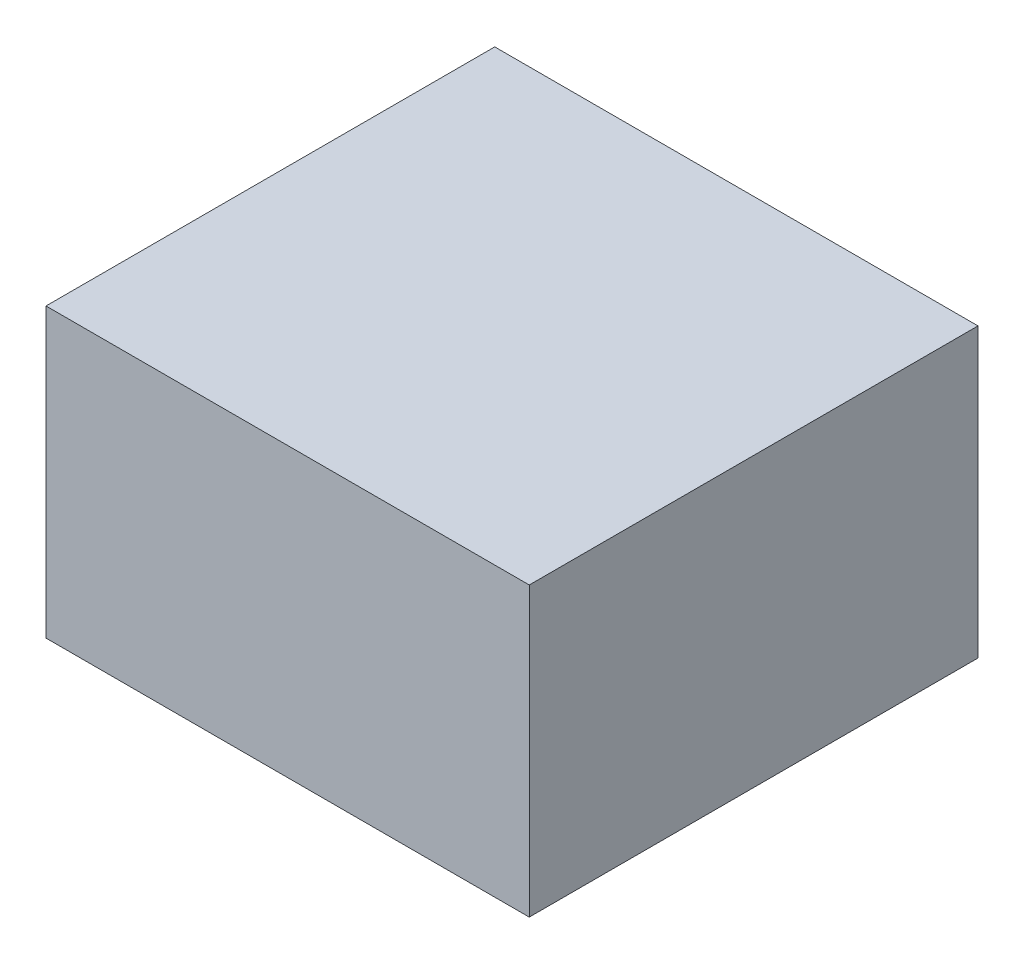
ISO-10303-21;
HEADER;
FILE_DESCRIPTION(('STEP AP214'),'2;1');
FILE_NAME('part.step','',(''),(''),'','','');
FILE_SCHEMA(('AUTOMOTIVE_DESIGN { 1 0 10303 214 1 1 1 1 }'));
ENDSEC;
DATA;
#1=APPLICATION_CONTEXT('core data for automotive mechanical design processes');
#2=APPLICATION_PROTOCOL_DEFINITION('international standard','automotive_design',2000,#1);
#3=PRODUCT_CONTEXT('',#1,'mechanical');
#4=PRODUCT('Part','Part','',(#3));
#5=PRODUCT_RELATED_PRODUCT_CATEGORY('part','',(#4));
#6=PRODUCT_DEFINITION_FORMATION('','',#4);
#7=PRODUCT_DEFINITION_CONTEXT('part definition',#1,'design');
#8=PRODUCT_DEFINITION('design','',#6,#7);
#9=PRODUCT_DEFINITION_SHAPE('','',#8);
#10=(LENGTH_UNIT() NAMED_UNIT(*) SI_UNIT(.MILLI.,.METRE.));
#11=(NAMED_UNIT(*) PLANE_ANGLE_UNIT() SI_UNIT($,.RADIAN.));
#12=(NAMED_UNIT(*) SI_UNIT($,.STERADIAN.) SOLID_ANGLE_UNIT());
#13=UNCERTAINTY_MEASURE_WITH_UNIT(LENGTH_MEASURE(1.E-05),#10,'distance_accuracy_value','');
#14=(GEOMETRIC_REPRESENTATION_CONTEXT(3) GLOBAL_UNCERTAINTY_ASSIGNED_CONTEXT((#13)) GLOBAL_UNIT_ASSIGNED_CONTEXT((#10,
#11,#12)) REPRESENTATION_CONTEXT('',''));
#15=CARTESIAN_POINT('',(0.,0.,0.));
#16=DIRECTION('',(0.,0.,1.));
#17=DIRECTION('',(1.,0.,0.));
#18=AXIS2_PLACEMENT_3D('',#15,#16,#17);
#19=CARTESIAN_POINT('',(-21.,-12.5,39.));
#20=DIRECTION('',(1.,0.,0.));
#21=DIRECTION('',(0.,0.,-1.));
#22=AXIS2_PLACEMENT_3D('',#19,#20,#21);
#23=PLANE('',#22);
#24=DIRECTION('',(0.,0.,1.));
#25=VECTOR('',#24,1.);
#26=CARTESIAN_POINT('',(-21.,1.21222729040687,39.));
#27=LINE('',#26,#25);
#28=CARTESIAN_POINT('',(-21.,1.21222729040687,6.));
#29=VERTEX_POINT('',#28);
#30=CARTESIAN_POINT('',(-21.,1.21222729040687,10.));
#31=VERTEX_POINT('',#30);
#32=EDGE_CURVE('E333',#29,#31,#27,.T.);
#33=ORIENTED_EDGE('',*,*,#32,.T.);
#34=DIRECTION('',(0.,-1.,0.));
#35=VECTOR('',#34,1.);
#36=CARTESIAN_POINT('',(-21.,-12.5,10.));
#37=LINE('',#36,#35);
#38=CARTESIAN_POINT('',(-21.,-1.78777270959313,10.));
#39=VERTEX_POINT('',#38);
#40=EDGE_CURVE('E326',#31,#39,#37,.T.);
#41=ORIENTED_EDGE('',*,*,#40,.T.);
#42=DIRECTION('',(0.,0.,-1.));
#43=VECTOR('',#42,1.);
#44=CARTESIAN_POINT('',(-21.,-1.78777270959313,39.));
#45=LINE('',#44,#43);
#46=CARTESIAN_POINT('',(-21.,-1.78777270959313,6.));
#47=VERTEX_POINT('',#46);
#48=EDGE_CURVE('E331',#39,#47,#45,.T.);
#49=ORIENTED_EDGE('',*,*,#48,.T.);
#50=DIRECTION('',(0.,1.,0.));
#51=VECTOR('',#50,1.);
#52=CARTESIAN_POINT('',(-21.,-12.5,6.));
#53=LINE('',#52,#51);
#54=EDGE_CURVE('E119',#47,#29,#53,.T.);
#55=ORIENTED_EDGE('',*,*,#54,.T.);
#56=EDGE_LOOP('',(#33,#41,#49,#55));
#57=FACE_BOUND('',#56,.T.);
#58=DIRECTION('',(0.,-1.,0.));
#59=VECTOR('',#58,1.);
#60=CARTESIAN_POINT('',(-21.,-12.5,0.));
#61=LINE('',#60,#59);
#62=CARTESIAN_POINT('',(-21.,12.5,0.));
#63=VERTEX_POINT('',#62);
#64=CARTESIAN_POINT('',(-21.,-12.5,0.));
#65=VERTEX_POINT('',#64);
#66=EDGE_CURVE('E132',#63,#65,#61,.T.);
#67=ORIENTED_EDGE('',*,*,#66,.T.);
#68=DIRECTION('',(0.,0.,-1.));
#69=VECTOR('',#68,1.);
#70=CARTESIAN_POINT('',(-21.,-12.5,39.));
#71=LINE('',#70,#69);
#72=CARTESIAN_POINT('',(-21.,-12.5,39.));
#73=VERTEX_POINT('',#72);
#74=EDGE_CURVE('E11',#73,#65,#71,.T.);
#75=ORIENTED_EDGE('',*,*,#74,.F.);
#76=DIRECTION('',(0.,-1.,0.));
#77=VECTOR('',#76,1.);
#78=CARTESIAN_POINT('',(-21.,-12.5,39.));
#79=LINE('',#78,#77);
#80=CARTESIAN_POINT('',(-21.,12.5,39.));
#81=VERTEX_POINT('',#80);
#82=EDGE_CURVE('E146',#81,#73,#79,.T.);
#83=ORIENTED_EDGE('',*,*,#82,.F.);
#84=DIRECTION('',(0.,0.,-1.));
#85=VECTOR('',#84,1.);
#86=CARTESIAN_POINT('',(-21.,12.5,39.));
#87=LINE('',#86,#85);
#88=EDGE_CURVE('E155',#81,#63,#87,.T.);
#89=ORIENTED_EDGE('',*,*,#88,.T.);
#90=EDGE_LOOP('',(#67,#75,#83,#89));
#91=FACE_BOUND('',#90,.T.);
#92=ADVANCED_FACE('F37',(#57,#91),#23,.F.);
#93=CARTESIAN_POINT('',(21.,-12.5,39.));
#94=DIRECTION('',(0.,1.,0.));
#95=DIRECTION('',(-1.,0.,0.));
#96=AXIS2_PLACEMENT_3D('',#93,#94,#95);
#97=PLANE('',#96);
#98=DIRECTION('',(1.,0.,0.));
#99=VECTOR('',#98,1.);
#100=CARTESIAN_POINT('',(21.,-12.5,0.));
#101=LINE('',#100,#99);
#102=CARTESIAN_POINT('',(21.,-12.5,0.));
#103=VERTEX_POINT('',#102);
#104=EDGE_CURVE('E136',#65,#103,#101,.T.);
#105=ORIENTED_EDGE('',*,*,#104,.T.);
#106=DIRECTION('',(0.,0.,-1.));
#107=VECTOR('',#106,1.);
#108=CARTESIAN_POINT('',(21.,-12.5,39.));
#109=LINE('',#108,#107);
#110=CARTESIAN_POINT('',(21.,-12.5,39.));
#111=VERTEX_POINT('',#110);
#112=EDGE_CURVE('E44',#111,#103,#109,.T.);
#113=ORIENTED_EDGE('',*,*,#112,.F.);
#114=DIRECTION('',(1.,0.,0.));
#115=VECTOR('',#114,1.);
#116=CARTESIAN_POINT('',(21.,-12.5,39.));
#117=LINE('',#116,#115);
#118=EDGE_CURVE('E149',#73,#111,#117,.T.);
#119=ORIENTED_EDGE('',*,*,#118,.F.);
#120=ORIENTED_EDGE('',*,*,#74,.T.);
#121=EDGE_LOOP('',(#105,#113,#119,#120));
#122=FACE_BOUND('',#121,.T.);
#123=ADVANCED_FACE('F186',(#122),#97,.F.);
#124=CARTESIAN_POINT('',(21.,-12.5,39.));
#125=DIRECTION('',(-1.,0.,0.));
#126=DIRECTION('',(0.,0.,1.));
#127=AXIS2_PLACEMENT_3D('',#124,#125,#126);
#128=PLANE('',#127);
#129=DIRECTION('',(0.,1.,0.));
#130=VECTOR('',#129,1.);
#131=CARTESIAN_POINT('',(21.,-12.5,0.));
#132=LINE('',#131,#130);
#133=CARTESIAN_POINT('',(21.,12.5,0.));
#134=VERTEX_POINT('',#133);
#135=EDGE_CURVE('E158',#103,#134,#132,.T.);
#136=ORIENTED_EDGE('',*,*,#135,.T.);
#137=DIRECTION('',(0.,0.,-1.));
#138=VECTOR('',#137,1.);
#139=CARTESIAN_POINT('',(21.,12.5,39.));
#140=LINE('',#139,#138);
#141=CARTESIAN_POINT('',(21.,12.5,39.));
#142=VERTEX_POINT('',#141);
#143=EDGE_CURVE('E163',#142,#134,#140,.T.);
#144=ORIENTED_EDGE('',*,*,#143,.F.);
#145=DIRECTION('',(0.,1.,0.));
#146=VECTOR('',#145,1.);
#147=CARTESIAN_POINT('',(21.,-12.5,39.));
#148=LINE('',#147,#146);
#149=EDGE_CURVE('E152',#111,#142,#148,.T.);
#150=ORIENTED_EDGE('',*,*,#149,.F.);
#151=ORIENTED_EDGE('',*,*,#112,.T.);
#152=EDGE_LOOP('',(#136,#144,#150,#151));
#153=FACE_BOUND('',#152,.T.);
#154=ADVANCED_FACE('F170',(#153),#128,.F.);
#155=CARTESIAN_POINT('',(21.,12.5,39.));
#156=DIRECTION('',(0.,-1.,0.));
#157=DIRECTION('',(1.,0.,0.));
#158=AXIS2_PLACEMENT_3D('',#155,#156,#157);
#159=PLANE('',#158);
#160=DIRECTION('',(-1.,0.,0.));
#161=VECTOR('',#160,1.);
#162=CARTESIAN_POINT('',(21.,12.5,0.));
#163=LINE('',#162,#161);
#164=EDGE_CURVE('E150',#134,#63,#163,.T.);
#165=ORIENTED_EDGE('',*,*,#164,.T.);
#166=ORIENTED_EDGE('',*,*,#88,.F.);
#167=DIRECTION('',(-1.,0.,0.));
#168=VECTOR('',#167,1.);
#169=CARTESIAN_POINT('',(21.,12.5,39.));
#170=LINE('',#169,#168);
#171=EDGE_CURVE('E154',#142,#81,#170,.T.);
#172=ORIENTED_EDGE('',*,*,#171,.F.);
#173=ORIENTED_EDGE('',*,*,#143,.T.);
#174=EDGE_LOOP('',(#165,#166,#172,#173));
#175=FACE_BOUND('',#174,.T.);
#176=ADVANCED_FACE('F179',(#175),#159,.F.);
#177=CARTESIAN_POINT('',(0.,0.,39.));
#178=DIRECTION('',(0.,0.,1.));
#179=DIRECTION('',(1.,0.,0.));
#180=AXIS2_PLACEMENT_3D('',#177,#178,#179);
#181=PLANE('',#180);
#182=ORIENTED_EDGE('',*,*,#82,.T.);
#183=ORIENTED_EDGE('',*,*,#118,.T.);
#184=ORIENTED_EDGE('',*,*,#149,.T.);
#185=ORIENTED_EDGE('',*,*,#171,.T.);
#186=EDGE_LOOP('',(#182,#183,#184,#185));
#187=FACE_BOUND('',#186,.T.);
#188=ADVANCED_FACE('F185',(#187),#181,.T.);
#189=CARTESIAN_POINT('',(0.,0.,0.));
#190=DIRECTION('',(0.,0.,1.));
#191=DIRECTION('',(1.,0.,0.));
#192=AXIS2_PLACEMENT_3D('',#189,#190,#191);
#193=PLANE('',#192);
#194=DIRECTION('',(1.,0.,0.));
#195=VECTOR('',#194,1.);
#196=CARTESIAN_POINT('',(-6.,1.21222729040687,0.));
#197=LINE('',#196,#195);
#198=CARTESIAN_POINT('',(-16.,1.21222729040687,0.));
#199=VERTEX_POINT('',#198);
#200=CARTESIAN_POINT('',(-6.,1.21222729040687,0.));
#201=VERTEX_POINT('',#200);
#202=EDGE_CURVE('E336',#199,#201,#197,.T.);
#203=ORIENTED_EDGE('',*,*,#202,.F.);
#204=DIRECTION('',(0.,1.,0.));
#205=VECTOR('',#204,1.);
#206=CARTESIAN_POINT('',(-16.,-1.78777270959313,0.));
#207=LINE('',#206,#205);
#208=CARTESIAN_POINT('',(-16.,-1.78777270959313,0.));
#209=VERTEX_POINT('',#208);
#210=EDGE_CURVE('E334',#209,#199,#207,.T.);
#211=ORIENTED_EDGE('',*,*,#210,.F.);
#212=DIRECTION('',(-1.,0.,0.));
#213=VECTOR('',#212,1.);
#214=CARTESIAN_POINT('',(-6.,-1.78777270959313,0.));
#215=LINE('',#214,#213);
#216=CARTESIAN_POINT('',(-6.,-1.78777270959313,0.));
#217=VERTEX_POINT('',#216);
#218=EDGE_CURVE('E130',#217,#209,#215,.T.);
#219=ORIENTED_EDGE('',*,*,#218,.F.);
#220=DIRECTION('',(0.,-1.,0.));
#221=VECTOR('',#220,1.);
#222=CARTESIAN_POINT('',(-6.,-1.78777270959313,0.));
#223=LINE('',#222,#221);
#224=EDGE_CURVE('E344',#201,#217,#223,.T.);
#225=ORIENTED_EDGE('',*,*,#224,.F.);
#226=EDGE_LOOP('',(#203,#211,#219,#225));
#227=FACE_BOUND('',#226,.T.);
#228=ORIENTED_EDGE('',*,*,#66,.F.);
#229=ORIENTED_EDGE('',*,*,#164,.F.);
#230=ORIENTED_EDGE('',*,*,#135,.F.);
#231=ORIENTED_EDGE('',*,*,#104,.F.);
#232=EDGE_LOOP('',(#228,#229,#230,#231));
#233=FACE_BOUND('',#232,.T.);
#234=ADVANCED_FACE('F176',(#227,#233),#193,.F.);
#235=CARTESIAN_POINT('',(-16.,-1.78777270959313,10.));
#236=DIRECTION('',(-1.,0.,0.));
#237=DIRECTION('',(0.,0.,1.));
#238=AXIS2_PLACEMENT_3D('',#235,#236,#237);
#239=PLANE('',#238);
#240=DIRECTION('',(0.,0.,-1.));
#241=VECTOR('',#240,1.);
#242=CARTESIAN_POINT('',(-16.,1.21222729040687,10.));
#243=LINE('',#242,#241);
#244=CARTESIAN_POINT('',(-16.,1.21222729040687,6.));
#245=VERTEX_POINT('',#244);
#246=EDGE_CURVE('E59',#245,#199,#243,.T.);
#247=ORIENTED_EDGE('',*,*,#246,.F.);
#248=DIRECTION('',(0.,1.,0.));
#249=VECTOR('',#248,1.);
#250=CARTESIAN_POINT('',(-16.,1.21222729040687,6.));
#251=LINE('',#250,#249);
#252=CARTESIAN_POINT('',(-16.,-1.78777270959313,6.));
#253=VERTEX_POINT('',#252);
#254=EDGE_CURVE('E117',#253,#245,#251,.T.);
#255=ORIENTED_EDGE('',*,*,#254,.F.);
#256=DIRECTION('',(0.,0.,-1.));
#257=VECTOR('',#256,1.);
#258=CARTESIAN_POINT('',(-16.,-1.78777270959313,10.));
#259=LINE('',#258,#257);
#260=EDGE_CURVE('E125',#253,#209,#259,.T.);
#261=ORIENTED_EDGE('',*,*,#260,.T.);
#262=ORIENTED_EDGE('',*,*,#210,.T.);
#263=EDGE_LOOP('',(#247,#255,#261,#262));
#264=FACE_BOUND('',#263,.T.);
#265=ADVANCED_FACE('F124',(#264),#239,.F.);
#266=CARTESIAN_POINT('',(-6.,-1.78777270959313,10.));
#267=DIRECTION('',(0.,-1.,0.));
#268=DIRECTION('',(0.,0.,-1.));
#269=AXIS2_PLACEMENT_3D('',#266,#267,#268);
#270=PLANE('',#269);
#271=ORIENTED_EDGE('',*,*,#218,.T.);
#272=ORIENTED_EDGE('',*,*,#260,.F.);
#273=DIRECTION('',(1.,0.,0.));
#274=VECTOR('',#273,1.);
#275=CARTESIAN_POINT('',(-26.,-1.78777270959313,6.));
#276=LINE('',#275,#274);
#277=EDGE_CURVE('E51',#47,#253,#276,.T.);
#278=ORIENTED_EDGE('',*,*,#277,.F.);
#279=ORIENTED_EDGE('',*,*,#48,.F.);
#280=DIRECTION('',(-1.,0.,0.));
#281=VECTOR('',#280,1.);
#282=CARTESIAN_POINT('',(-6.,-1.78777270959313,10.));
#283=LINE('',#282,#281);
#284=CARTESIAN_POINT('',(-6.,-1.78777270959313,10.));
#285=VERTEX_POINT('',#284);
#286=EDGE_CURVE('E145',#285,#39,#283,.T.);
#287=ORIENTED_EDGE('',*,*,#286,.F.);
#288=DIRECTION('',(0.,0.,-1.));
#289=VECTOR('',#288,1.);
#290=CARTESIAN_POINT('',(-6.,-1.78777270959313,10.));
#291=LINE('',#290,#289);
#292=EDGE_CURVE('E133',#285,#217,#291,.T.);
#293=ORIENTED_EDGE('',*,*,#292,.T.);
#294=EDGE_LOOP('',(#271,#272,#278,#279,#287,#293));
#295=FACE_BOUND('',#294,.T.);
#296=ADVANCED_FACE('F128',(#295),#270,.F.);
#297=CARTESIAN_POINT('',(-6.,-1.78777270959313,10.));
#298=DIRECTION('',(1.,0.,0.));
#299=DIRECTION('',(0.,0.,-1.));
#300=AXIS2_PLACEMENT_3D('',#297,#298,#299);
#301=PLANE('',#300);
#302=ORIENTED_EDGE('',*,*,#224,.T.);
#303=ORIENTED_EDGE('',*,*,#292,.F.);
#304=DIRECTION('',(0.,-1.,0.));
#305=VECTOR('',#304,1.);
#306=CARTESIAN_POINT('',(-6.,-1.78777270959313,10.));
#307=LINE('',#306,#305);
#308=CARTESIAN_POINT('',(-6.,1.21222729040687,10.));
#309=VERTEX_POINT('',#308);
#310=EDGE_CURVE('E329',#309,#285,#307,.T.);
#311=ORIENTED_EDGE('',*,*,#310,.F.);
#312=DIRECTION('',(0.,0.,-1.));
#313=VECTOR('',#312,1.);
#314=CARTESIAN_POINT('',(-6.,1.21222729040687,10.));
#315=LINE('',#314,#313);
#316=EDGE_CURVE('E138',#309,#201,#315,.T.);
#317=ORIENTED_EDGE('',*,*,#316,.T.);
#318=EDGE_LOOP('',(#302,#303,#311,#317));
#319=FACE_BOUND('',#318,.T.);
#320=ADVANCED_FACE('F209',(#319),#301,.F.);
#321=CARTESIAN_POINT('',(-6.,1.21222729040687,10.));
#322=DIRECTION('',(0.,1.,0.));
#323=DIRECTION('',(0.,0.,1.));
#324=AXIS2_PLACEMENT_3D('',#321,#322,#323);
#325=PLANE('',#324);
#326=ORIENTED_EDGE('',*,*,#202,.T.);
#327=ORIENTED_EDGE('',*,*,#316,.F.);
#328=DIRECTION('',(1.,0.,0.));
#329=VECTOR('',#328,1.);
#330=CARTESIAN_POINT('',(-6.,1.21222729040687,10.));
#331=LINE('',#330,#329);
#332=EDGE_CURVE('E341',#31,#309,#331,.T.);
#333=ORIENTED_EDGE('',*,*,#332,.F.);
#334=ORIENTED_EDGE('',*,*,#32,.F.);
#335=DIRECTION('',(1.,0.,0.));
#336=VECTOR('',#335,1.);
#337=CARTESIAN_POINT('',(-26.,1.21222729040687,6.));
#338=LINE('',#337,#336);
#339=EDGE_CURVE('E121',#29,#245,#338,.T.);
#340=ORIENTED_EDGE('',*,*,#339,.T.);
#341=ORIENTED_EDGE('',*,*,#246,.T.);
#342=EDGE_LOOP('',(#326,#327,#333,#334,#340,#341));
#343=FACE_BOUND('',#342,.T.);
#344=ADVANCED_FACE('F205',(#343),#325,.F.);
#345=CARTESIAN_POINT('',(0.,0.,10.));
#346=DIRECTION('',(0.,0.,1.));
#347=DIRECTION('',(1.,0.,0.));
#348=AXIS2_PLACEMENT_3D('',#345,#346,#347);
#349=PLANE('',#348);
#350=ORIENTED_EDGE('',*,*,#286,.T.);
#351=ORIENTED_EDGE('',*,*,#40,.F.);
#352=ORIENTED_EDGE('',*,*,#332,.T.);
#353=ORIENTED_EDGE('',*,*,#310,.T.);
#354=EDGE_LOOP('',(#350,#351,#352,#353));
#355=FACE_BOUND('',#354,.T.);
#356=ADVANCED_FACE('F208',(#355),#349,.F.);
#357=CARTESIAN_POINT('',(-26.,1.21222729040687,6.));
#358=DIRECTION('',(0.,0.,-1.));
#359=DIRECTION('',(-1.,0.,0.));
#360=AXIS2_PLACEMENT_3D('',#357,#358,#359);
#361=PLANE('',#360);
#362=ORIENTED_EDGE('',*,*,#277,.T.);
#363=ORIENTED_EDGE('',*,*,#254,.T.);
#364=ORIENTED_EDGE('',*,*,#339,.F.);
#365=ORIENTED_EDGE('',*,*,#54,.F.);
#366=EDGE_LOOP('',(#362,#363,#364,#365));
#367=FACE_BOUND('',#366,.T.);
#368=ADVANCED_FACE('F115',(#367),#361,.F.);
#369=CLOSED_SHELL('',(#92,#123,#154,#176,#188,#234,#265,#296,#320,#344,#356,#368));
#370=MANIFOLD_SOLID_BREP('B2',#369);
#371=ADVANCED_BREP_SHAPE_REPRESENTATION('',(#18,#370),#14);
#372=SHAPE_DEFINITION_REPRESENTATION(#9,#371);
ENDSEC;
END-ISO-10303-21;
